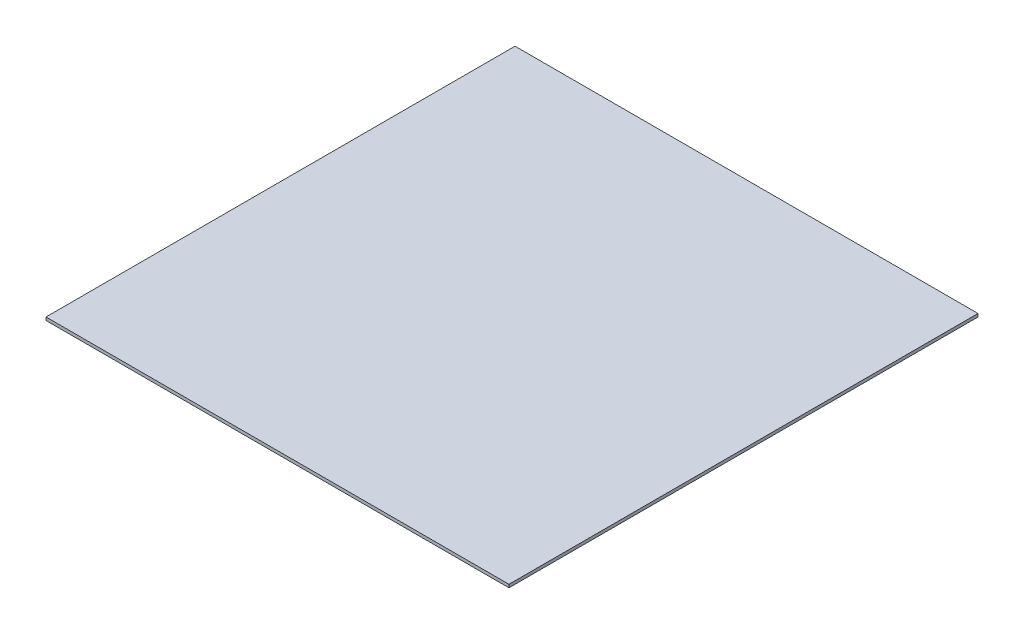
ISO-10303-21;
HEADER;
FILE_DESCRIPTION(('STEP AP214'),'2;1');
FILE_NAME('part.step','',(''),(''),'','','');
FILE_SCHEMA(('AUTOMOTIVE_DESIGN { 1 0 10303 214 1 1 1 1 }'));
ENDSEC;
DATA;
#1=APPLICATION_CONTEXT('core data for automotive mechanical design processes');
#2=APPLICATION_PROTOCOL_DEFINITION('international standard','automotive_design',2000,#1);
#3=PRODUCT_CONTEXT('',#1,'mechanical');
#4=PRODUCT('Part','Part','',(#3));
#5=PRODUCT_RELATED_PRODUCT_CATEGORY('part','',(#4));
#6=PRODUCT_DEFINITION_FORMATION('','',#4);
#7=PRODUCT_DEFINITION_CONTEXT('part definition',#1,'design');
#8=PRODUCT_DEFINITION('design','',#6,#7);
#9=PRODUCT_DEFINITION_SHAPE('','',#8);
#10=(LENGTH_UNIT() NAMED_UNIT(*) SI_UNIT(.MILLI.,.METRE.));
#11=(NAMED_UNIT(*) PLANE_ANGLE_UNIT() SI_UNIT($,.RADIAN.));
#12=(NAMED_UNIT(*) SI_UNIT($,.STERADIAN.) SOLID_ANGLE_UNIT());
#13=UNCERTAINTY_MEASURE_WITH_UNIT(LENGTH_MEASURE(1.E-05),#10,'distance_accuracy_value','');
#14=(GEOMETRIC_REPRESENTATION_CONTEXT(3) GLOBAL_UNCERTAINTY_ASSIGNED_CONTEXT((#13)) GLOBAL_UNIT_ASSIGNED_CONTEXT((#10,
#11,#12)) REPRESENTATION_CONTEXT('',''));
#15=CARTESIAN_POINT('',(0.,0.,0.));
#16=DIRECTION('',(0.,0.,1.));
#17=DIRECTION('',(1.,0.,0.));
#18=AXIS2_PLACEMENT_3D('',#15,#16,#17);
#19=CARTESIAN_POINT('',(225.65,3.,-228.6));
#20=DIRECTION('',(-1.,0.,0.));
#21=DIRECTION('',(0.,0.,1.));
#22=AXIS2_PLACEMENT_3D('',#19,#20,#21);
#23=PLANE('',#22);
#24=DIRECTION('',(0.,0.,-1.));
#25=VECTOR('',#24,1.);
#26=CARTESIAN_POINT('',(225.65,0.,-228.6));
#27=LINE('',#26,#25);
#28=CARTESIAN_POINT('',(225.65,0.,228.6));
#29=VERTEX_POINT('',#28);
#30=CARTESIAN_POINT('',(225.65,0.,-228.6));
#31=VERTEX_POINT('',#30);
#32=EDGE_CURVE('E95',#29,#31,#27,.T.);
#33=ORIENTED_EDGE('',*,*,#32,.T.);
#34=DIRECTION('',(0.,-1.,0.));
#35=VECTOR('',#34,1.);
#36=CARTESIAN_POINT('',(225.65,3.,-228.6));
#37=LINE('',#36,#35);
#38=CARTESIAN_POINT('',(225.65,3.,-228.6));
#39=VERTEX_POINT('',#38);
#40=EDGE_CURVE('E11',#39,#31,#37,.T.);
#41=ORIENTED_EDGE('',*,*,#40,.F.);
#42=DIRECTION('',(0.,0.,-1.));
#43=VECTOR('',#42,1.);
#44=CARTESIAN_POINT('',(225.65,3.,-228.6));
#45=LINE('',#44,#43);
#46=CARTESIAN_POINT('',(225.65,3.,228.6));
#47=VERTEX_POINT('',#46);
#48=EDGE_CURVE('E83',#47,#39,#45,.T.);
#49=ORIENTED_EDGE('',*,*,#48,.F.);
#50=DIRECTION('',(0.,-1.,0.));
#51=VECTOR('',#50,1.);
#52=CARTESIAN_POINT('',(225.65,3.,228.6));
#53=LINE('',#52,#51);
#54=EDGE_CURVE('E91',#47,#29,#53,.T.);
#55=ORIENTED_EDGE('',*,*,#54,.T.);
#56=EDGE_LOOP('',(#33,#41,#49,#55));
#57=FACE_BOUND('',#56,.T.);
#58=ADVANCED_FACE('F32',(#57),#23,.F.);
#59=CARTESIAN_POINT('',(-225.65,3.,-228.6));
#60=DIRECTION('',(0.,0.,1.));
#61=DIRECTION('',(1.,0.,0.));
#62=AXIS2_PLACEMENT_3D('',#59,#60,#61);
#63=PLANE('',#62);
#64=DIRECTION('',(-1.,0.,0.));
#65=VECTOR('',#64,1.);
#66=CARTESIAN_POINT('',(-225.65,0.,-228.6));
#67=LINE('',#66,#65);
#68=CARTESIAN_POINT('',(-225.65,0.,-228.6));
#69=VERTEX_POINT('',#68);
#70=EDGE_CURVE('E87',#31,#69,#67,.T.);
#71=ORIENTED_EDGE('',*,*,#70,.T.);
#72=DIRECTION('',(0.,-1.,0.));
#73=VECTOR('',#72,1.);
#74=CARTESIAN_POINT('',(-225.65,3.,-228.6));
#75=LINE('',#74,#73);
#76=CARTESIAN_POINT('',(-225.65,3.,-228.6));
#77=VERTEX_POINT('',#76);
#78=EDGE_CURVE('E40',#77,#69,#75,.T.);
#79=ORIENTED_EDGE('',*,*,#78,.F.);
#80=DIRECTION('',(-1.,0.,0.));
#81=VECTOR('',#80,1.);
#82=CARTESIAN_POINT('',(-225.65,3.,-228.6));
#83=LINE('',#82,#81);
#84=EDGE_CURVE('E78',#39,#77,#83,.T.);
#85=ORIENTED_EDGE('',*,*,#84,.F.);
#86=ORIENTED_EDGE('',*,*,#40,.T.);
#87=EDGE_LOOP('',(#71,#79,#85,#86));
#88=FACE_BOUND('',#87,.T.);
#89=ADVANCED_FACE('F86',(#88),#63,.F.);
#90=CARTESIAN_POINT('',(-225.65,3.,-228.6));
#91=DIRECTION('',(1.,0.,0.));
#92=DIRECTION('',(0.,0.,-1.));
#93=AXIS2_PLACEMENT_3D('',#90,#91,#92);
#94=PLANE('',#93);
#95=DIRECTION('',(0.,0.,1.));
#96=VECTOR('',#95,1.);
#97=CARTESIAN_POINT('',(-225.65,0.,-228.6));
#98=LINE('',#97,#96);
#99=CARTESIAN_POINT('',(-225.65,0.,228.6));
#100=VERTEX_POINT('',#99);
#101=EDGE_CURVE('E65',#69,#100,#98,.T.);
#102=ORIENTED_EDGE('',*,*,#101,.T.);
#103=DIRECTION('',(0.,-1.,0.));
#104=VECTOR('',#103,1.);
#105=CARTESIAN_POINT('',(-225.65,3.,228.6));
#106=LINE('',#105,#104);
#107=CARTESIAN_POINT('',(-225.65,3.,228.6));
#108=VERTEX_POINT('',#107);
#109=EDGE_CURVE('E88',#108,#100,#106,.T.);
#110=ORIENTED_EDGE('',*,*,#109,.F.);
#111=DIRECTION('',(0.,0.,1.));
#112=VECTOR('',#111,1.);
#113=CARTESIAN_POINT('',(-225.65,3.,-228.6));
#114=LINE('',#113,#112);
#115=EDGE_CURVE('E81',#77,#108,#114,.T.);
#116=ORIENTED_EDGE('',*,*,#115,.F.);
#117=ORIENTED_EDGE('',*,*,#78,.T.);
#118=EDGE_LOOP('',(#102,#110,#116,#117));
#119=FACE_BOUND('',#118,.T.);
#120=ADVANCED_FACE('F89',(#119),#94,.F.);
#121=CARTESIAN_POINT('',(-225.65,3.,228.6));
#122=DIRECTION('',(0.,0.,-1.));
#123=DIRECTION('',(-1.,0.,0.));
#124=AXIS2_PLACEMENT_3D('',#121,#122,#123);
#125=PLANE('',#124);
#126=DIRECTION('',(1.,0.,0.));
#127=VECTOR('',#126,1.);
#128=CARTESIAN_POINT('',(-225.65,0.,228.6));
#129=LINE('',#128,#127);
#130=EDGE_CURVE('E71',#100,#29,#129,.T.);
#131=ORIENTED_EDGE('',*,*,#130,.T.);
#132=ORIENTED_EDGE('',*,*,#54,.F.);
#133=DIRECTION('',(1.,0.,0.));
#134=VECTOR('',#133,1.);
#135=CARTESIAN_POINT('',(-225.65,3.,228.6));
#136=LINE('',#135,#134);
#137=EDGE_CURVE('E48',#108,#47,#136,.T.);
#138=ORIENTED_EDGE('',*,*,#137,.F.);
#139=ORIENTED_EDGE('',*,*,#109,.T.);
#140=EDGE_LOOP('',(#131,#132,#138,#139));
#141=FACE_BOUND('',#140,.T.);
#142=ADVANCED_FACE('F102',(#141),#125,.F.);
#143=CARTESIAN_POINT('',(0.,3.,0.));
#144=DIRECTION('',(0.,1.,0.));
#145=DIRECTION('',(0.,0.,1.));
#146=AXIS2_PLACEMENT_3D('',#143,#144,#145);
#147=PLANE('',#146);
#148=ORIENTED_EDGE('',*,*,#48,.T.);
#149=ORIENTED_EDGE('',*,*,#84,.T.);
#150=ORIENTED_EDGE('',*,*,#115,.T.);
#151=ORIENTED_EDGE('',*,*,#137,.T.);
#152=EDGE_LOOP('',(#148,#149,#150,#151));
#153=FACE_BOUND('',#152,.T.);
#154=ADVANCED_FACE('F79',(#153),#147,.T.);
#155=CARTESIAN_POINT('',(0.,0.,0.));
#156=DIRECTION('',(0.,1.,0.));
#157=DIRECTION('',(0.,0.,1.));
#158=AXIS2_PLACEMENT_3D('',#155,#156,#157);
#159=PLANE('',#158);
#160=ORIENTED_EDGE('',*,*,#32,.F.);
#161=ORIENTED_EDGE('',*,*,#130,.F.);
#162=ORIENTED_EDGE('',*,*,#101,.F.);
#163=ORIENTED_EDGE('',*,*,#70,.F.);
#164=EDGE_LOOP('',(#160,#161,#162,#163));
#165=FACE_BOUND('',#164,.T.);
#166=ADVANCED_FACE('F105',(#165),#159,.F.);
#167=CLOSED_SHELL('',(#58,#89,#120,#142,#154,#166));
#168=MANIFOLD_SOLID_BREP('B2',#167);
#169=ADVANCED_BREP_SHAPE_REPRESENTATION('',(#18,#168),#14);
#170=SHAPE_DEFINITION_REPRESENTATION(#9,#169);
ENDSEC;
END-ISO-10303-21;
